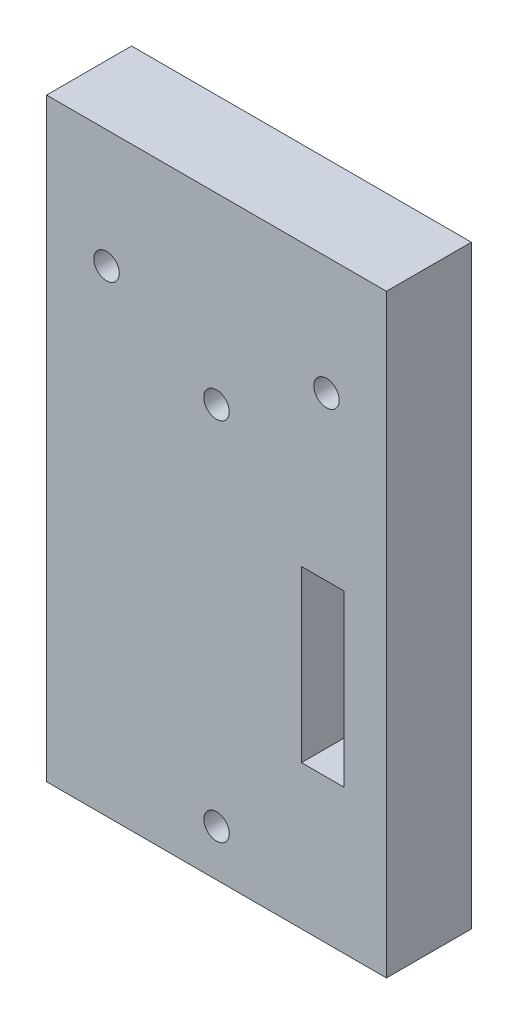
ISO-10303-21;
HEADER;
FILE_DESCRIPTION(('STEP AP214'),'2;1');
FILE_NAME('part.step','',(''),(''),'','','');
FILE_SCHEMA(('AUTOMOTIVE_DESIGN { 1 0 10303 214 1 1 1 1 }'));
ENDSEC;
DATA;
#1=APPLICATION_CONTEXT('core data for automotive mechanical design processes');
#2=APPLICATION_PROTOCOL_DEFINITION('international standard','automotive_design',2000,#1);
#3=PRODUCT_CONTEXT('',#1,'mechanical');
#4=PRODUCT('Part','Part','',(#3));
#5=PRODUCT_RELATED_PRODUCT_CATEGORY('part','',(#4));
#6=PRODUCT_DEFINITION_FORMATION('','',#4);
#7=PRODUCT_DEFINITION_CONTEXT('part definition',#1,'design');
#8=PRODUCT_DEFINITION('design','',#6,#7);
#9=PRODUCT_DEFINITION_SHAPE('','',#8);
#10=(LENGTH_UNIT() NAMED_UNIT(*) SI_UNIT(.MILLI.,.METRE.));
#11=(NAMED_UNIT(*) PLANE_ANGLE_UNIT() SI_UNIT($,.RADIAN.));
#12=(NAMED_UNIT(*) SI_UNIT($,.STERADIAN.) SOLID_ANGLE_UNIT());
#13=UNCERTAINTY_MEASURE_WITH_UNIT(LENGTH_MEASURE(1.E-05),#10,'distance_accuracy_value','');
#14=(GEOMETRIC_REPRESENTATION_CONTEXT(3) GLOBAL_UNCERTAINTY_ASSIGNED_CONTEXT((#13)) GLOBAL_UNIT_ASSIGNED_CONTEXT((#10,
#11,#12)) REPRESENTATION_CONTEXT('',''));
#15=CARTESIAN_POINT('',(0.,0.,0.));
#16=DIRECTION('',(0.,0.,1.));
#17=DIRECTION('',(1.,0.,0.));
#18=AXIS2_PLACEMENT_3D('',#15,#16,#17);
#19=CARTESIAN_POINT('',(20.,-26.9533820234114,10.));
#20=DIRECTION('',(0.,0.,1.));
#21=DIRECTION('',(1.,0.,0.));
#22=AXIS2_PLACEMENT_3D('',#19,#20,#21);
#23=PLANE('',#22);
#24=CARTESIAN_POINT('',(0.,-21.5,10.));
#25=DIRECTION('',(0.,0.,1.));
#26=DIRECTION('',(1.,0.,0.));
#27=AXIS2_PLACEMENT_3D('',#24,#25,#26);
#28=CIRCLE('',#27,1.5);
#29=CARTESIAN_POINT('',(1.50000000000001,-21.5,10.));
#30=VERTEX_POINT('',#29);
#31=EDGE_CURVE('E125',#30,#30,#28,.T.);
#32=ORIENTED_EDGE('',*,*,#31,.F.);
#33=EDGE_LOOP('',(#32));
#34=FACE_BOUND('',#33,.T.);
#35=CARTESIAN_POINT('',(-12.9453351170569,29.1430701505017,10.));
#36=DIRECTION('',(0.,0.,1.));
#37=DIRECTION('',(1.,0.,0.));
#38=AXIS2_PLACEMENT_3D('',#35,#36,#37);
#39=CIRCLE('',#38,1.5);
#40=CARTESIAN_POINT('',(-11.4453351170569,29.1430701505017,10.));
#41=VERTEX_POINT('',#40);
#42=EDGE_CURVE('E135',#41,#41,#39,.T.);
#43=ORIENTED_EDGE('',*,*,#42,.F.);
#44=EDGE_LOOP('',(#43));
#45=FACE_BOUND('',#44,.T.);
#46=DIRECTION('',(0.,1.,0.));
#47=VECTOR('',#46,1.);
#48=CARTESIAN_POINT('',(20.,43.0466179765886,10.));
#49=LINE('',#48,#47);
#50=CARTESIAN_POINT('',(20.,-26.9533820234114,10.));
#51=VERTEX_POINT('',#50);
#52=CARTESIAN_POINT('',(20.,43.0466179765886,10.));
#53=VERTEX_POINT('',#52);
#54=EDGE_CURVE('E147',#51,#53,#49,.T.);
#55=ORIENTED_EDGE('',*,*,#54,.T.);
#56=DIRECTION('',(-1.,0.,0.));
#57=VECTOR('',#56,1.);
#58=CARTESIAN_POINT('',(-20.,43.0466179765886,10.));
#59=LINE('',#58,#57);
#60=CARTESIAN_POINT('',(-20.,43.0466179765886,10.));
#61=VERTEX_POINT('',#60);
#62=EDGE_CURVE('E150',#53,#61,#59,.T.);
#63=ORIENTED_EDGE('',*,*,#62,.T.);
#64=DIRECTION('',(0.,-1.,0.));
#65=VECTOR('',#64,1.);
#66=CARTESIAN_POINT('',(-20.,43.0466179765886,10.));
#67=LINE('',#66,#65);
#68=CARTESIAN_POINT('',(-20.,-26.9533820234114,10.));
#69=VERTEX_POINT('',#68);
#70=EDGE_CURVE('E153',#61,#69,#67,.T.);
#71=ORIENTED_EDGE('',*,*,#70,.T.);
#72=DIRECTION('',(1.,0.,0.));
#73=VECTOR('',#72,1.);
#74=CARTESIAN_POINT('',(-20.,-26.9533820234114,10.));
#75=LINE('',#74,#73);
#76=EDGE_CURVE('E155',#69,#51,#75,.T.);
#77=ORIENTED_EDGE('',*,*,#76,.T.);
#78=EDGE_LOOP('',(#55,#63,#71,#77));
#79=FACE_BOUND('',#78,.T.);
#80=CARTESIAN_POINT('',(12.9453351170569,29.1430701505017,10.));
#81=DIRECTION('',(0.,0.,1.));
#82=DIRECTION('',(1.,0.,0.));
#83=AXIS2_PLACEMENT_3D('',#80,#81,#82);
#84=CIRCLE('',#83,1.5);
#85=CARTESIAN_POINT('',(14.4453351170569,29.1430701505017,10.));
#86=VERTEX_POINT('',#85);
#87=EDGE_CURVE('E141',#86,#86,#84,.T.);
#88=ORIENTED_EDGE('',*,*,#87,.F.);
#89=EDGE_LOOP('',(#88));
#90=FACE_BOUND('',#89,.T.);
#91=DIRECTION('',(1.,0.,0.));
#92=VECTOR('',#91,1.);
#93=CARTESIAN_POINT('',(10.,-10.,10.));
#94=LINE('',#93,#92);
#95=CARTESIAN_POINT('',(10.,-10.,10.));
#96=VERTEX_POINT('',#95);
#97=CARTESIAN_POINT('',(15.,-10.,10.));
#98=VERTEX_POINT('',#97);
#99=EDGE_CURVE('E104',#96,#98,#94,.T.);
#100=ORIENTED_EDGE('',*,*,#99,.F.);
#101=DIRECTION('',(0.,-1.,0.));
#102=VECTOR('',#101,1.);
#103=CARTESIAN_POINT('',(10.,10.,10.));
#104=LINE('',#103,#102);
#105=CARTESIAN_POINT('',(10.,10.,10.));
#106=VERTEX_POINT('',#105);
#107=EDGE_CURVE('E96',#106,#96,#104,.T.);
#108=ORIENTED_EDGE('',*,*,#107,.F.);
#109=DIRECTION('',(-1.,0.,0.));
#110=VECTOR('',#109,1.);
#111=CARTESIAN_POINT('',(10.,10.,10.));
#112=LINE('',#111,#110);
#113=CARTESIAN_POINT('',(15.,10.,10.));
#114=VERTEX_POINT('',#113);
#115=EDGE_CURVE('E119',#114,#106,#112,.T.);
#116=ORIENTED_EDGE('',*,*,#115,.F.);
#117=DIRECTION('',(0.,1.,0.));
#118=VECTOR('',#117,1.);
#119=CARTESIAN_POINT('',(15.,10.,10.));
#120=LINE('',#119,#118);
#121=EDGE_CURVE('E117',#98,#114,#120,.T.);
#122=ORIENTED_EDGE('',*,*,#121,.F.);
#123=EDGE_LOOP('',(#100,#108,#116,#122));
#124=FACE_BOUND('',#123,.T.);
#125=CARTESIAN_POINT('',(0.,21.5,10.));
#126=DIRECTION('',(0.,0.,1.));
#127=DIRECTION('',(1.,0.,0.));
#128=AXIS2_PLACEMENT_3D('',#125,#126,#127);
#129=CIRCLE('',#128,1.5);
#130=CARTESIAN_POINT('',(1.49999999999999,21.5,10.));
#131=VERTEX_POINT('',#130);
#132=EDGE_CURVE('E231',#131,#131,#129,.T.);
#133=ORIENTED_EDGE('',*,*,#132,.F.);
#134=EDGE_LOOP('',(#133));
#135=FACE_BOUND('',#134,.T.);
#136=ADVANCED_FACE('F31',(#34,#45,#79,#90,#124,#135),#23,.T.);
#137=CARTESIAN_POINT('',(20.,-26.9533820234114,0.));
#138=DIRECTION('',(0.,0.,1.));
#139=DIRECTION('',(1.,0.,0.));
#140=AXIS2_PLACEMENT_3D('',#137,#138,#139);
#141=PLANE('',#140);
#142=CARTESIAN_POINT('',(0.,-21.5,0.));
#143=DIRECTION('',(0.,0.,1.));
#144=DIRECTION('',(1.,0.,0.));
#145=AXIS2_PLACEMENT_3D('',#142,#143,#144);
#146=CIRCLE('',#145,1.5);
#147=CARTESIAN_POINT('',(1.50000000000001,-21.5,0.));
#148=VERTEX_POINT('',#147);
#149=EDGE_CURVE('E234',#148,#148,#146,.T.);
#150=ORIENTED_EDGE('',*,*,#149,.T.);
#151=EDGE_LOOP('',(#150));
#152=FACE_BOUND('',#151,.T.);
#153=CARTESIAN_POINT('',(-12.9453351170569,29.1430701505017,0.));
#154=DIRECTION('',(0.,0.,1.));
#155=DIRECTION('',(1.,0.,0.));
#156=AXIS2_PLACEMENT_3D('',#153,#154,#155);
#157=CIRCLE('',#156,1.5);
#158=CARTESIAN_POINT('',(-11.4453351170569,29.1430701505017,0.));
#159=VERTEX_POINT('',#158);
#160=EDGE_CURVE('E112',#159,#159,#157,.T.);
#161=ORIENTED_EDGE('',*,*,#160,.T.);
#162=EDGE_LOOP('',(#161));
#163=FACE_BOUND('',#162,.T.);
#164=DIRECTION('',(0.,1.,0.));
#165=VECTOR('',#164,1.);
#166=CARTESIAN_POINT('',(20.,43.0466179765886,0.));
#167=LINE('',#166,#165);
#168=CARTESIAN_POINT('',(20.,-26.9533820234114,0.));
#169=VERTEX_POINT('',#168);
#170=CARTESIAN_POINT('',(20.,43.0466179765886,0.));
#171=VERTEX_POINT('',#170);
#172=EDGE_CURVE('E144',#169,#171,#167,.T.);
#173=ORIENTED_EDGE('',*,*,#172,.F.);
#174=DIRECTION('',(1.,0.,0.));
#175=VECTOR('',#174,1.);
#176=CARTESIAN_POINT('',(-20.,-26.9533820234114,0.));
#177=LINE('',#176,#175);
#178=CARTESIAN_POINT('',(-20.,-26.9533820234114,0.));
#179=VERTEX_POINT('',#178);
#180=EDGE_CURVE('E151',#179,#169,#177,.T.);
#181=ORIENTED_EDGE('',*,*,#180,.F.);
#182=DIRECTION('',(0.,-1.,0.));
#183=VECTOR('',#182,1.);
#184=CARTESIAN_POINT('',(-20.,43.0466179765886,0.));
#185=LINE('',#184,#183);
#186=CARTESIAN_POINT('',(-20.,43.0466179765886,0.));
#187=VERTEX_POINT('',#186);
#188=EDGE_CURVE('E162',#187,#179,#185,.T.);
#189=ORIENTED_EDGE('',*,*,#188,.F.);
#190=DIRECTION('',(-1.,0.,0.));
#191=VECTOR('',#190,1.);
#192=CARTESIAN_POINT('',(-20.,43.0466179765886,0.));
#193=LINE('',#192,#191);
#194=EDGE_CURVE('E160',#171,#187,#193,.T.);
#195=ORIENTED_EDGE('',*,*,#194,.F.);
#196=EDGE_LOOP('',(#173,#181,#189,#195));
#197=FACE_BOUND('',#196,.T.);
#198=CARTESIAN_POINT('',(12.9453351170569,29.1430701505017,0.));
#199=DIRECTION('',(0.,0.,1.));
#200=DIRECTION('',(1.,0.,0.));
#201=AXIS2_PLACEMENT_3D('',#198,#199,#200);
#202=CIRCLE('',#201,1.5);
#203=CARTESIAN_POINT('',(14.4453351170569,29.1430701505017,0.));
#204=VERTEX_POINT('',#203);
#205=EDGE_CURVE('E138',#204,#204,#202,.T.);
#206=ORIENTED_EDGE('',*,*,#205,.T.);
#207=EDGE_LOOP('',(#206));
#208=FACE_BOUND('',#207,.T.);
#209=DIRECTION('',(0.,-1.,0.));
#210=VECTOR('',#209,1.);
#211=CARTESIAN_POINT('',(10.,10.,0.));
#212=LINE('',#211,#210);
#213=CARTESIAN_POINT('',(10.,10.,0.));
#214=VERTEX_POINT('',#213);
#215=CARTESIAN_POINT('',(10.,-10.,0.));
#216=VERTEX_POINT('',#215);
#217=EDGE_CURVE('E54',#214,#216,#212,.T.);
#218=ORIENTED_EDGE('',*,*,#217,.T.);
#219=DIRECTION('',(1.,0.,0.));
#220=VECTOR('',#219,1.);
#221=CARTESIAN_POINT('',(10.,-10.,0.));
#222=LINE('',#221,#220);
#223=CARTESIAN_POINT('',(15.,-10.,0.));
#224=VERTEX_POINT('',#223);
#225=EDGE_CURVE('E111',#216,#224,#222,.T.);
#226=ORIENTED_EDGE('',*,*,#225,.T.);
#227=DIRECTION('',(0.,1.,0.));
#228=VECTOR('',#227,1.);
#229=CARTESIAN_POINT('',(15.,10.,0.));
#230=LINE('',#229,#228);
#231=CARTESIAN_POINT('',(15.,10.,0.));
#232=VERTEX_POINT('',#231);
#233=EDGE_CURVE('E127',#224,#232,#230,.T.);
#234=ORIENTED_EDGE('',*,*,#233,.T.);
#235=DIRECTION('',(-1.,0.,0.));
#236=VECTOR('',#235,1.);
#237=CARTESIAN_POINT('',(10.,10.,0.));
#238=LINE('',#237,#236);
#239=EDGE_CURVE('E105',#232,#214,#238,.T.);
#240=ORIENTED_EDGE('',*,*,#239,.T.);
#241=EDGE_LOOP('',(#218,#226,#234,#240));
#242=FACE_BOUND('',#241,.T.);
#243=CARTESIAN_POINT('',(0.,21.5,0.));
#244=DIRECTION('',(0.,0.,1.));
#245=DIRECTION('',(1.,0.,0.));
#246=AXIS2_PLACEMENT_3D('',#243,#244,#245);
#247=CIRCLE('',#246,1.5);
#248=CARTESIAN_POINT('',(1.49999999999999,21.5,0.));
#249=VERTEX_POINT('',#248);
#250=EDGE_CURVE('E229',#249,#249,#247,.T.);
#251=ORIENTED_EDGE('',*,*,#250,.T.);
#252=EDGE_LOOP('',(#251));
#253=FACE_BOUND('',#252,.T.);
#254=ADVANCED_FACE('F180',(#152,#163,#197,#208,#242,#253),#141,.F.);
#255=CARTESIAN_POINT('',(20.,43.0466179765886,10.));
#256=DIRECTION('',(-1.,0.,0.));
#257=DIRECTION('',(0.,-1.,0.));
#258=AXIS2_PLACEMENT_3D('',#255,#256,#257);
#259=PLANE('',#258);
#260=ORIENTED_EDGE('',*,*,#172,.T.);
#261=DIRECTION('',(0.,0.,-1.));
#262=VECTOR('',#261,1.);
#263=CARTESIAN_POINT('',(20.,43.0466179765886,10.));
#264=LINE('',#263,#262);
#265=EDGE_CURVE('E11',#53,#171,#264,.T.);
#266=ORIENTED_EDGE('',*,*,#265,.F.);
#267=ORIENTED_EDGE('',*,*,#54,.F.);
#268=DIRECTION('',(0.,0.,-1.));
#269=VECTOR('',#268,1.);
#270=CARTESIAN_POINT('',(20.,-26.9533820234114,10.));
#271=LINE('',#270,#269);
#272=EDGE_CURVE('E157',#51,#169,#271,.T.);
#273=ORIENTED_EDGE('',*,*,#272,.T.);
#274=EDGE_LOOP('',(#260,#266,#267,#273));
#275=FACE_BOUND('',#274,.T.);
#276=ADVANCED_FACE('F33',(#275),#259,.F.);
#277=CARTESIAN_POINT('',(-20.,43.0466179765886,10.));
#278=DIRECTION('',(0.,-1.,0.));
#279=DIRECTION('',(0.,0.,-1.));
#280=AXIS2_PLACEMENT_3D('',#277,#278,#279);
#281=PLANE('',#280);
#282=ORIENTED_EDGE('',*,*,#194,.T.);
#283=DIRECTION('',(0.,0.,-1.));
#284=VECTOR('',#283,1.);
#285=CARTESIAN_POINT('',(-20.,43.0466179765886,10.));
#286=LINE('',#285,#284);
#287=EDGE_CURVE('E39',#61,#187,#286,.T.);
#288=ORIENTED_EDGE('',*,*,#287,.F.);
#289=ORIENTED_EDGE('',*,*,#62,.F.);
#290=ORIENTED_EDGE('',*,*,#265,.T.);
#291=EDGE_LOOP('',(#282,#288,#289,#290));
#292=FACE_BOUND('',#291,.T.);
#293=ADVANCED_FACE('F191',(#292),#281,.F.);
#294=CARTESIAN_POINT('',(-20.,43.0466179765886,10.));
#295=DIRECTION('',(1.,0.,0.));
#296=DIRECTION('',(0.,1.,0.));
#297=AXIS2_PLACEMENT_3D('',#294,#295,#296);
#298=PLANE('',#297);
#299=ORIENTED_EDGE('',*,*,#188,.T.);
#300=DIRECTION('',(0.,0.,-1.));
#301=VECTOR('',#300,1.);
#302=CARTESIAN_POINT('',(-20.,-26.9533820234114,10.));
#303=LINE('',#302,#301);
#304=EDGE_CURVE('E167',#69,#179,#303,.T.);
#305=ORIENTED_EDGE('',*,*,#304,.F.);
#306=ORIENTED_EDGE('',*,*,#70,.F.);
#307=ORIENTED_EDGE('',*,*,#287,.T.);
#308=EDGE_LOOP('',(#299,#305,#306,#307));
#309=FACE_BOUND('',#308,.T.);
#310=ADVANCED_FACE('F174',(#309),#298,.F.);
#311=CARTESIAN_POINT('',(-20.,-26.9533820234114,10.));
#312=DIRECTION('',(0.,1.,0.));
#313=DIRECTION('',(-1.,0.,0.));
#314=AXIS2_PLACEMENT_3D('',#311,#312,#313);
#315=PLANE('',#314);
#316=ORIENTED_EDGE('',*,*,#180,.T.);
#317=ORIENTED_EDGE('',*,*,#272,.F.);
#318=ORIENTED_EDGE('',*,*,#76,.F.);
#319=ORIENTED_EDGE('',*,*,#304,.T.);
#320=EDGE_LOOP('',(#316,#317,#318,#319));
#321=FACE_BOUND('',#320,.T.);
#322=ADVANCED_FACE('F184',(#321),#315,.F.);
#323=CARTESIAN_POINT('',(12.9453351170569,29.1430701505017,10.));
#324=DIRECTION('',(0.,0.,-1.));
#325=DIRECTION('',(-1.,0.,0.));
#326=AXIS2_PLACEMENT_3D('',#323,#324,#325);
#327=CYLINDRICAL_SURFACE('',#326,1.5);
#328=ORIENTED_EDGE('',*,*,#87,.T.);
#329=EDGE_LOOP('',(#328));
#330=FACE_BOUND('',#329,.T.);
#331=ORIENTED_EDGE('',*,*,#205,.F.);
#332=EDGE_LOOP('',(#331));
#333=FACE_BOUND('',#332,.T.);
#334=ADVANCED_FACE('F209',(#330,#333),#327,.F.);
#335=CARTESIAN_POINT('',(-12.9453351170569,29.1430701505017,10.));
#336=DIRECTION('',(0.,0.,-1.));
#337=DIRECTION('',(-1.,0.,0.));
#338=AXIS2_PLACEMENT_3D('',#335,#336,#337);
#339=CYLINDRICAL_SURFACE('',#338,1.5);
#340=ORIENTED_EDGE('',*,*,#42,.T.);
#341=EDGE_LOOP('',(#340));
#342=FACE_BOUND('',#341,.T.);
#343=ORIENTED_EDGE('',*,*,#160,.F.);
#344=EDGE_LOOP('',(#343));
#345=FACE_BOUND('',#344,.T.);
#346=ADVANCED_FACE('F216',(#342,#345),#339,.F.);
#347=CARTESIAN_POINT('',(10.,10.,10.));
#348=DIRECTION('',(1.,0.,0.));
#349=DIRECTION('',(0.,0.,-1.));
#350=AXIS2_PLACEMENT_3D('',#347,#348,#349);
#351=PLANE('',#350);
#352=ORIENTED_EDGE('',*,*,#217,.F.);
#353=DIRECTION('',(0.,0.,-1.));
#354=VECTOR('',#353,1.);
#355=CARTESIAN_POINT('',(10.,10.,10.));
#356=LINE('',#355,#354);
#357=EDGE_CURVE('E100',#106,#214,#356,.T.);
#358=ORIENTED_EDGE('',*,*,#357,.F.);
#359=ORIENTED_EDGE('',*,*,#107,.T.);
#360=DIRECTION('',(0.,0.,-1.));
#361=VECTOR('',#360,1.);
#362=CARTESIAN_POINT('',(10.,-10.,10.));
#363=LINE('',#362,#361);
#364=EDGE_CURVE('E99',#96,#216,#363,.T.);
#365=ORIENTED_EDGE('',*,*,#364,.T.);
#366=EDGE_LOOP('',(#352,#358,#359,#365));
#367=FACE_BOUND('',#366,.T.);
#368=ADVANCED_FACE('F98',(#367),#351,.T.);
#369=CARTESIAN_POINT('',(10.,-10.,10.));
#370=DIRECTION('',(0.,1.,0.));
#371=DIRECTION('',(0.,0.,1.));
#372=AXIS2_PLACEMENT_3D('',#369,#370,#371);
#373=PLANE('',#372);
#374=ORIENTED_EDGE('',*,*,#225,.F.);
#375=ORIENTED_EDGE('',*,*,#364,.F.);
#376=ORIENTED_EDGE('',*,*,#99,.T.);
#377=DIRECTION('',(0.,0.,-1.));
#378=VECTOR('',#377,1.);
#379=CARTESIAN_POINT('',(15.,-10.,10.));
#380=LINE('',#379,#378);
#381=EDGE_CURVE('E113',#98,#224,#380,.T.);
#382=ORIENTED_EDGE('',*,*,#381,.T.);
#383=EDGE_LOOP('',(#374,#375,#376,#382));
#384=FACE_BOUND('',#383,.T.);
#385=ADVANCED_FACE('F108',(#384),#373,.T.);
#386=CARTESIAN_POINT('',(15.,10.,10.));
#387=DIRECTION('',(-1.,0.,0.));
#388=DIRECTION('',(0.,0.,1.));
#389=AXIS2_PLACEMENT_3D('',#386,#387,#388);
#390=PLANE('',#389);
#391=ORIENTED_EDGE('',*,*,#233,.F.);
#392=ORIENTED_EDGE('',*,*,#381,.F.);
#393=ORIENTED_EDGE('',*,*,#121,.T.);
#394=DIRECTION('',(0.,0.,-1.));
#395=VECTOR('',#394,1.);
#396=CARTESIAN_POINT('',(15.,10.,10.));
#397=LINE('',#396,#395);
#398=EDGE_CURVE('E46',#114,#232,#397,.T.);
#399=ORIENTED_EDGE('',*,*,#398,.T.);
#400=EDGE_LOOP('',(#391,#392,#393,#399));
#401=FACE_BOUND('',#400,.T.);
#402=ADVANCED_FACE('F254',(#401),#390,.T.);
#403=CARTESIAN_POINT('',(10.,10.,10.));
#404=DIRECTION('',(0.,-1.,0.));
#405=DIRECTION('',(0.,0.,-1.));
#406=AXIS2_PLACEMENT_3D('',#403,#404,#405);
#407=PLANE('',#406);
#408=ORIENTED_EDGE('',*,*,#239,.F.);
#409=ORIENTED_EDGE('',*,*,#398,.F.);
#410=ORIENTED_EDGE('',*,*,#115,.T.);
#411=ORIENTED_EDGE('',*,*,#357,.T.);
#412=EDGE_LOOP('',(#408,#409,#410,#411));
#413=FACE_BOUND('',#412,.T.);
#414=ADVANCED_FACE('F245',(#413),#407,.T.);
#415=CARTESIAN_POINT('',(0.,-21.5,10.));
#416=DIRECTION('',(0.,0.,-1.));
#417=DIRECTION('',(-1.,0.,0.));
#418=AXIS2_PLACEMENT_3D('',#415,#416,#417);
#419=CYLINDRICAL_SURFACE('',#418,1.5);
#420=ORIENTED_EDGE('',*,*,#31,.T.);
#421=EDGE_LOOP('',(#420));
#422=FACE_BOUND('',#421,.T.);
#423=ORIENTED_EDGE('',*,*,#149,.F.);
#424=EDGE_LOOP('',(#423));
#425=FACE_BOUND('',#424,.T.);
#426=ADVANCED_FACE('F242',(#422,#425),#419,.F.);
#427=CARTESIAN_POINT('',(0.,21.5,10.));
#428=DIRECTION('',(0.,0.,-1.));
#429=DIRECTION('',(-1.,0.,0.));
#430=AXIS2_PLACEMENT_3D('',#427,#428,#429);
#431=CYLINDRICAL_SURFACE('',#430,1.5);
#432=ORIENTED_EDGE('',*,*,#132,.T.);
#433=EDGE_LOOP('',(#432));
#434=FACE_BOUND('',#433,.T.);
#435=ORIENTED_EDGE('',*,*,#250,.F.);
#436=EDGE_LOOP('',(#435));
#437=FACE_BOUND('',#436,.T.);
#438=ADVANCED_FACE('F244',(#434,#437),#431,.F.);
#439=CLOSED_SHELL('',(#136,#254,#276,#293,#310,#322,#334,#346,#368,#385,#402,#414,#426,#438));
#440=MANIFOLD_SOLID_BREP('B2',#439);
#441=ADVANCED_BREP_SHAPE_REPRESENTATION('',(#18,#440),#14);
#442=SHAPE_DEFINITION_REPRESENTATION(#9,#441);
ENDSEC;
END-ISO-10303-21;
